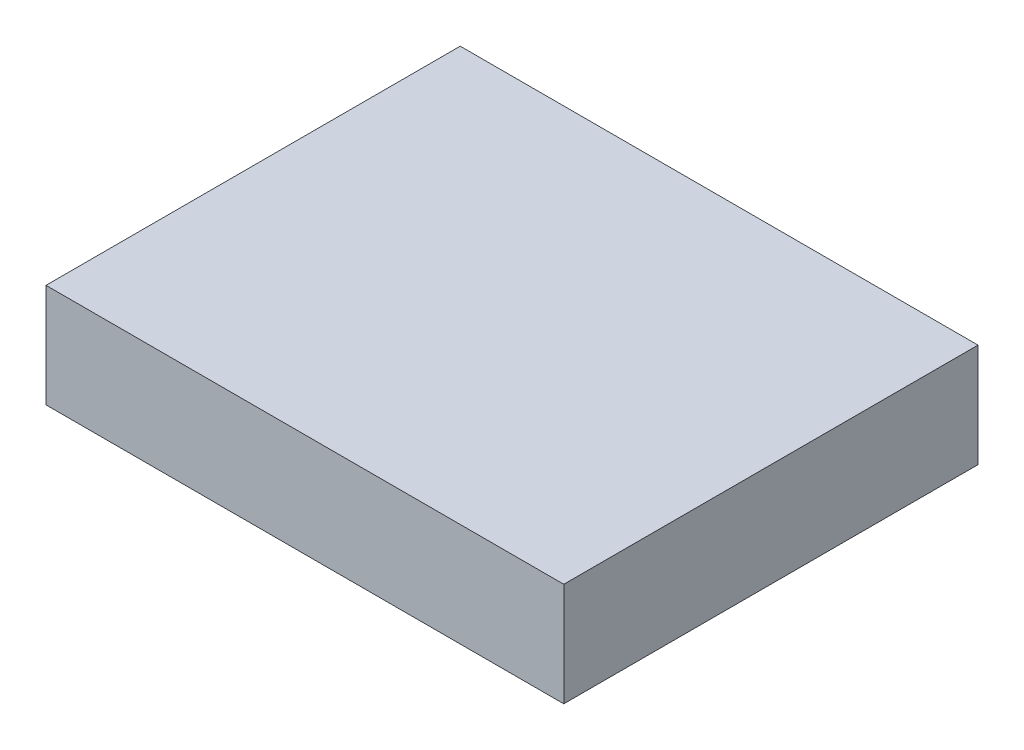
ISO-10303-21;
HEADER;
FILE_DESCRIPTION(('STEP AP214'),'2;1');
FILE_NAME('part.step','',(''),(''),'','','');
FILE_SCHEMA(('AUTOMOTIVE_DESIGN { 1 0 10303 214 1 1 1 1 }'));
ENDSEC;
DATA;
#1=APPLICATION_CONTEXT('core data for automotive mechanical design processes');
#2=APPLICATION_PROTOCOL_DEFINITION('international standard','automotive_design',2000,#1);
#3=PRODUCT_CONTEXT('',#1,'mechanical');
#4=PRODUCT('Part','Part','',(#3));
#5=PRODUCT_RELATED_PRODUCT_CATEGORY('part','',(#4));
#6=PRODUCT_DEFINITION_FORMATION('','',#4);
#7=PRODUCT_DEFINITION_CONTEXT('part definition',#1,'design');
#8=PRODUCT_DEFINITION('design','',#6,#7);
#9=PRODUCT_DEFINITION_SHAPE('','',#8);
#10=(LENGTH_UNIT() NAMED_UNIT(*) SI_UNIT(.MILLI.,.METRE.));
#11=(NAMED_UNIT(*) PLANE_ANGLE_UNIT() SI_UNIT($,.RADIAN.));
#12=(NAMED_UNIT(*) SI_UNIT($,.STERADIAN.) SOLID_ANGLE_UNIT());
#13=UNCERTAINTY_MEASURE_WITH_UNIT(LENGTH_MEASURE(1.E-05),#10,'distance_accuracy_value','');
#14=(GEOMETRIC_REPRESENTATION_CONTEXT(3) GLOBAL_UNCERTAINTY_ASSIGNED_CONTEXT((#13)) GLOBAL_UNIT_ASSIGNED_CONTEXT((#10,
#11,#12)) REPRESENTATION_CONTEXT('',''));
#15=CARTESIAN_POINT('',(0.,0.,0.));
#16=DIRECTION('',(0.,0.,1.));
#17=DIRECTION('',(1.,0.,0.));
#18=AXIS2_PLACEMENT_3D('',#15,#16,#17);
#19=CARTESIAN_POINT('',(0.,0.,20.));
#20=DIRECTION('',(1.,0.,0.));
#21=DIRECTION('',(0.,0.,-1.));
#22=AXIS2_PLACEMENT_3D('',#19,#20,#21);
#23=PLANE('',#22);
#24=DIRECTION('',(0.,-1.,0.));
#25=VECTOR('',#24,1.);
#26=CARTESIAN_POINT('',(0.,0.,0.));
#27=LINE('',#26,#25);
#28=CARTESIAN_POINT('',(0.,5.,0.));
#29=VERTEX_POINT('',#28);
#30=CARTESIAN_POINT('',(0.,0.,0.));
#31=VERTEX_POINT('',#30);
#32=EDGE_CURVE('E105',#29,#31,#27,.T.);
#33=ORIENTED_EDGE('',*,*,#32,.T.);
#34=DIRECTION('',(0.,0.,-1.));
#35=VECTOR('',#34,1.);
#36=CARTESIAN_POINT('',(0.,0.,20.));
#37=LINE('',#36,#35);
#38=CARTESIAN_POINT('',(0.,0.,20.));
#39=VERTEX_POINT('',#38);
#40=EDGE_CURVE('E11',#39,#31,#37,.T.);
#41=ORIENTED_EDGE('',*,*,#40,.F.);
#42=DIRECTION('',(0.,-1.,0.));
#43=VECTOR('',#42,1.);
#44=CARTESIAN_POINT('',(0.,0.,20.));
#45=LINE('',#44,#43);
#46=CARTESIAN_POINT('',(0.,5.,20.));
#47=VERTEX_POINT('',#46);
#48=EDGE_CURVE('E89',#47,#39,#45,.T.);
#49=ORIENTED_EDGE('',*,*,#48,.F.);
#50=DIRECTION('',(0.,0.,-1.));
#51=VECTOR('',#50,1.);
#52=CARTESIAN_POINT('',(0.,5.,20.));
#53=LINE('',#52,#51);
#54=EDGE_CURVE('E97',#47,#29,#53,.T.);
#55=ORIENTED_EDGE('',*,*,#54,.T.);
#56=EDGE_LOOP('',(#33,#41,#49,#55));
#57=FACE_BOUND('',#56,.T.);
#58=ADVANCED_FACE('F39',(#57),#23,.F.);
#59=CARTESIAN_POINT('',(0.,0.,20.));
#60=DIRECTION('',(0.,1.,0.));
#61=DIRECTION('',(0.,0.,1.));
#62=AXIS2_PLACEMENT_3D('',#59,#60,#61);
#63=PLANE('',#62);
#64=DIRECTION('',(1.,0.,0.));
#65=VECTOR('',#64,1.);
#66=CARTESIAN_POINT('',(0.,0.,0.));
#67=LINE('',#66,#65);
#68=CARTESIAN_POINT('',(25.,0.,0.));
#69=VERTEX_POINT('',#68);
#70=EDGE_CURVE('E92',#31,#69,#67,.T.);
#71=ORIENTED_EDGE('',*,*,#70,.T.);
#72=DIRECTION('',(0.,0.,-1.));
#73=VECTOR('',#72,1.);
#74=CARTESIAN_POINT('',(25.,0.,20.));
#75=LINE('',#74,#73);
#76=CARTESIAN_POINT('',(25.,0.,20.));
#77=VERTEX_POINT('',#76);
#78=EDGE_CURVE('E50',#77,#69,#75,.T.);
#79=ORIENTED_EDGE('',*,*,#78,.F.);
#80=DIRECTION('',(1.,0.,0.));
#81=VECTOR('',#80,1.);
#82=CARTESIAN_POINT('',(0.,0.,20.));
#83=LINE('',#82,#81);
#84=EDGE_CURVE('E82',#39,#77,#83,.T.);
#85=ORIENTED_EDGE('',*,*,#84,.F.);
#86=ORIENTED_EDGE('',*,*,#40,.T.);
#87=EDGE_LOOP('',(#71,#79,#85,#86));
#88=FACE_BOUND('',#87,.T.);
#89=ADVANCED_FACE('F93',(#88),#63,.F.);
#90=CARTESIAN_POINT('',(25.,0.,20.));
#91=DIRECTION('',(-1.,0.,0.));
#92=DIRECTION('',(0.,0.,1.));
#93=AXIS2_PLACEMENT_3D('',#90,#91,#92);
#94=PLANE('',#93);
#95=DIRECTION('',(0.,1.,0.));
#96=VECTOR('',#95,1.);
#97=CARTESIAN_POINT('',(25.,0.,0.));
#98=LINE('',#97,#96);
#99=CARTESIAN_POINT('',(25.,5.,0.));
#100=VERTEX_POINT('',#99);
#101=EDGE_CURVE('E72',#69,#100,#98,.T.);
#102=ORIENTED_EDGE('',*,*,#101,.T.);
#103=DIRECTION('',(0.,0.,-1.));
#104=VECTOR('',#103,1.);
#105=CARTESIAN_POINT('',(25.,5.,20.));
#106=LINE('',#105,#104);
#107=CARTESIAN_POINT('',(25.,5.,20.));
#108=VERTEX_POINT('',#107);
#109=EDGE_CURVE('E94',#108,#100,#106,.T.);
#110=ORIENTED_EDGE('',*,*,#109,.F.);
#111=DIRECTION('',(0.,1.,0.));
#112=VECTOR('',#111,1.);
#113=CARTESIAN_POINT('',(25.,0.,20.));
#114=LINE('',#113,#112);
#115=EDGE_CURVE('E88',#77,#108,#114,.T.);
#116=ORIENTED_EDGE('',*,*,#115,.F.);
#117=ORIENTED_EDGE('',*,*,#78,.T.);
#118=EDGE_LOOP('',(#102,#110,#116,#117));
#119=FACE_BOUND('',#118,.T.);
#120=ADVANCED_FACE('F96',(#119),#94,.F.);
#121=CARTESIAN_POINT('',(0.,5.,20.));
#122=DIRECTION('',(0.,-1.,0.));
#123=DIRECTION('',(0.,0.,-1.));
#124=AXIS2_PLACEMENT_3D('',#121,#122,#123);
#125=PLANE('',#124);
#126=DIRECTION('',(-1.,0.,0.));
#127=VECTOR('',#126,1.);
#128=CARTESIAN_POINT('',(0.,5.,0.));
#129=LINE('',#128,#127);
#130=EDGE_CURVE('E76',#100,#29,#129,.T.);
#131=ORIENTED_EDGE('',*,*,#130,.T.);
#132=ORIENTED_EDGE('',*,*,#54,.F.);
#133=DIRECTION('',(-1.,0.,0.));
#134=VECTOR('',#133,1.);
#135=CARTESIAN_POINT('',(0.,5.,20.));
#136=LINE('',#135,#134);
#137=EDGE_CURVE('E54',#108,#47,#136,.T.);
#138=ORIENTED_EDGE('',*,*,#137,.F.);
#139=ORIENTED_EDGE('',*,*,#109,.T.);
#140=EDGE_LOOP('',(#131,#132,#138,#139));
#141=FACE_BOUND('',#140,.T.);
#142=ADVANCED_FACE('F108',(#141),#125,.F.);
#143=CARTESIAN_POINT('',(0.,0.,20.));
#144=DIRECTION('',(0.,0.,-1.));
#145=DIRECTION('',(-1.,0.,0.));
#146=AXIS2_PLACEMENT_3D('',#143,#144,#145);
#147=PLANE('',#146);
#148=ORIENTED_EDGE('',*,*,#48,.T.);
#149=ORIENTED_EDGE('',*,*,#84,.T.);
#150=ORIENTED_EDGE('',*,*,#115,.T.);
#151=ORIENTED_EDGE('',*,*,#137,.T.);
#152=EDGE_LOOP('',(#148,#149,#150,#151));
#153=FACE_BOUND('',#152,.T.);
#154=ADVANCED_FACE('F86',(#153),#147,.F.);
#155=CARTESIAN_POINT('',(0.,0.,0.));
#156=DIRECTION('',(0.,0.,-1.));
#157=DIRECTION('',(-1.,0.,0.));
#158=AXIS2_PLACEMENT_3D('',#155,#156,#157);
#159=PLANE('',#158);
#160=ORIENTED_EDGE('',*,*,#32,.F.);
#161=ORIENTED_EDGE('',*,*,#130,.F.);
#162=ORIENTED_EDGE('',*,*,#101,.F.);
#163=ORIENTED_EDGE('',*,*,#70,.F.);
#164=EDGE_LOOP('',(#160,#161,#162,#163));
#165=FACE_BOUND('',#164,.T.);
#166=ADVANCED_FACE('F115',(#165),#159,.T.);
#167=CLOSED_SHELL('',(#58,#89,#120,#142,#154,#166));
#168=MANIFOLD_SOLID_BREP('B2',#167);
#169=ADVANCED_BREP_SHAPE_REPRESENTATION('',(#18,#168),#14);
#170=SHAPE_DEFINITION_REPRESENTATION(#9,#169);
ENDSEC;
END-ISO-10303-21;
